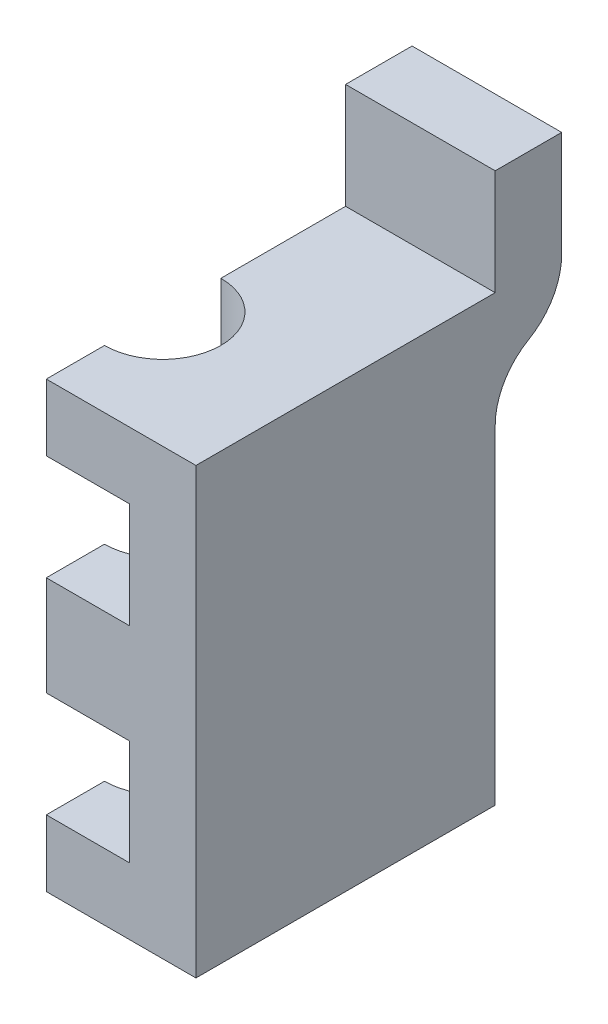
ISO-10303-21;
HEADER;
FILE_DESCRIPTION(('STEP AP214'),'2;1');
FILE_NAME('part.step','',(''),(''),'','','');
FILE_SCHEMA(('AUTOMOTIVE_DESIGN { 1 0 10303 214 1 1 1 1 }'));
ENDSEC;
DATA;
#1=APPLICATION_CONTEXT('core data for automotive mechanical design processes');
#2=APPLICATION_PROTOCOL_DEFINITION('international standard','automotive_design',2000,#1);
#3=PRODUCT_CONTEXT('',#1,'mechanical');
#4=PRODUCT('Part','Part','',(#3));
#5=PRODUCT_RELATED_PRODUCT_CATEGORY('part','',(#4));
#6=PRODUCT_DEFINITION_FORMATION('','',#4);
#7=PRODUCT_DEFINITION_CONTEXT('part definition',#1,'design');
#8=PRODUCT_DEFINITION('design','',#6,#7);
#9=PRODUCT_DEFINITION_SHAPE('','',#8);
#10=(LENGTH_UNIT() NAMED_UNIT(*) SI_UNIT(.MILLI.,.METRE.));
#11=(NAMED_UNIT(*) PLANE_ANGLE_UNIT() SI_UNIT($,.RADIAN.));
#12=(NAMED_UNIT(*) SI_UNIT($,.STERADIAN.) SOLID_ANGLE_UNIT());
#13=UNCERTAINTY_MEASURE_WITH_UNIT(LENGTH_MEASURE(1.E-05),#10,'distance_accuracy_value','');
#14=(GEOMETRIC_REPRESENTATION_CONTEXT(3) GLOBAL_UNCERTAINTY_ASSIGNED_CONTEXT((#13)) GLOBAL_UNIT_ASSIGNED_CONTEXT((#10,
#11,#12)) REPRESENTATION_CONTEXT('',''));
#15=CARTESIAN_POINT('',(0.,0.,0.));
#16=DIRECTION('',(0.,0.,1.));
#17=DIRECTION('',(1.,0.,0.));
#18=AXIS2_PLACEMENT_3D('',#15,#16,#17);
#19=CARTESIAN_POINT('',(0.,-11.35,3.5));
#20=DIRECTION('',(1.,0.,0.));
#21=DIRECTION('',(0.,1.,0.));
#22=AXIS2_PLACEMENT_3D('',#19,#20,#21);
#23=PLANE('',#22);
#24=DIRECTION('',(0.,0.,-1.));
#25=VECTOR('',#24,1.);
#26=CARTESIAN_POINT('',(0.,-13.35,3.5));
#27=LINE('',#26,#25);
#28=CARTESIAN_POINT('',(0.,-13.35,-1.75));
#29=VERTEX_POINT('',#28);
#30=CARTESIAN_POINT('',(0.,-13.35,-5.5));
#31=VERTEX_POINT('',#30);
#32=EDGE_CURVE('E376',#29,#31,#27,.T.);
#33=ORIENTED_EDGE('',*,*,#32,.F.);
#34=DIRECTION('',(0.,1.,0.));
#35=VECTOR('',#34,1.);
#36=CARTESIAN_POINT('',(0.,-13.35,-1.75));
#37=LINE('',#36,#35);
#38=CARTESIAN_POINT('',(0.,-11.35,-1.75));
#39=VERTEX_POINT('',#38);
#40=EDGE_CURVE('E267',#29,#39,#37,.T.);
#41=ORIENTED_EDGE('',*,*,#40,.T.);
#42=DIRECTION('',(0.,0.,-1.));
#43=VECTOR('',#42,1.);
#44=CARTESIAN_POINT('',(0.,-11.35,3.5));
#45=LINE('',#44,#43);
#46=CARTESIAN_POINT('',(0.,-11.35,-3.5));
#47=VERTEX_POINT('',#46);
#48=EDGE_CURVE('E381',#39,#47,#45,.T.);
#49=ORIENTED_EDGE('',*,*,#48,.T.);
#50=DIRECTION('',(0.,1.,0.));
#51=VECTOR('',#50,1.);
#52=CARTESIAN_POINT('',(0.,0.,-3.5));
#53=LINE('',#52,#51);
#54=CARTESIAN_POINT('',(0.,-8.175,-3.5));
#55=VERTEX_POINT('',#54);
#56=EDGE_CURVE('E289',#47,#55,#53,.T.);
#57=ORIENTED_EDGE('',*,*,#56,.T.);
#58=DIRECTION('',(0.,0.,-1.));
#59=VECTOR('',#58,1.);
#60=CARTESIAN_POINT('',(0.,-8.175,3.5));
#61=LINE('',#60,#59);
#62=CARTESIAN_POINT('',(0.,-8.175,-1.75));
#63=VERTEX_POINT('',#62);
#64=EDGE_CURVE('E394',#63,#55,#61,.T.);
#65=ORIENTED_EDGE('',*,*,#64,.F.);
#66=CARTESIAN_POINT('',(0.,-5.175,-1.75));
#67=VERTEX_POINT('',#66);
#68=EDGE_CURVE('E272',#63,#67,#37,.T.);
#69=ORIENTED_EDGE('',*,*,#68,.T.);
#70=DIRECTION('',(0.,0.,-1.));
#71=VECTOR('',#70,1.);
#72=CARTESIAN_POINT('',(0.,-5.175,3.5));
#73=LINE('',#72,#71);
#74=CARTESIAN_POINT('',(0.,-5.175,-3.5));
#75=VERTEX_POINT('',#74);
#76=EDGE_CURVE('E399',#67,#75,#73,.T.);
#77=ORIENTED_EDGE('',*,*,#76,.T.);
#78=CARTESIAN_POINT('',(0.,-2.,-3.5));
#79=VERTEX_POINT('',#78);
#80=EDGE_CURVE('E301',#75,#79,#53,.T.);
#81=ORIENTED_EDGE('',*,*,#80,.T.);
#82=DIRECTION('',(0.,0.,-1.));
#83=VECTOR('',#82,1.);
#84=CARTESIAN_POINT('',(0.,-2.,3.5));
#85=LINE('',#84,#83);
#86=CARTESIAN_POINT('',(0.,-2.,-1.75));
#87=VERTEX_POINT('',#86);
#88=EDGE_CURVE('E412',#87,#79,#85,.T.);
#89=ORIENTED_EDGE('',*,*,#88,.F.);
#90=CARTESIAN_POINT('',(0.,0.,-1.75));
#91=VERTEX_POINT('',#90);
#92=EDGE_CURVE('E271',#87,#91,#37,.T.);
#93=ORIENTED_EDGE('',*,*,#92,.T.);
#94=DIRECTION('',(0.,0.,-1.));
#95=VECTOR('',#94,1.);
#96=CARTESIAN_POINT('',(0.,0.,3.5));
#97=LINE('',#96,#95);
#98=CARTESIAN_POINT('',(0.,0.,-5.5));
#99=VERTEX_POINT('',#98);
#100=EDGE_CURVE('E343',#91,#99,#97,.T.);
#101=ORIENTED_EDGE('',*,*,#100,.T.);
#102=DIRECTION('',(0.,1.,0.));
#103=VECTOR('',#102,1.);
#104=CARTESIAN_POINT('',(0.,3.175,-5.5));
#105=LINE('',#104,#103);
#106=CARTESIAN_POINT('',(0.,3.175,-5.5));
#107=VERTEX_POINT('',#106);
#108=EDGE_CURVE('E231',#99,#107,#105,.T.);
#109=ORIENTED_EDGE('',*,*,#108,.T.);
#110=DIRECTION('',(0.,0.,-1.));
#111=VECTOR('',#110,1.);
#112=CARTESIAN_POINT('',(0.,3.175,-7.5));
#113=LINE('',#112,#111);
#114=CARTESIAN_POINT('',(0.,3.175,-7.5));
#115=VERTEX_POINT('',#114);
#116=EDGE_CURVE('E227',#107,#115,#113,.T.);
#117=ORIENTED_EDGE('',*,*,#116,.T.);
#118=DIRECTION('',(0.,-1.,0.));
#119=VECTOR('',#118,1.);
#120=CARTESIAN_POINT('',(0.,3.175,-7.5));
#121=LINE('',#120,#119);
#122=CARTESIAN_POINT('',(0.,0.,-7.5));
#123=VERTEX_POINT('',#122);
#124=EDGE_CURVE('E238',#115,#123,#121,.T.);
#125=ORIENTED_EDGE('',*,*,#124,.T.);
#126=CARTESIAN_POINT('',(0.,0.,-5.5));
#127=DIRECTION('',(-1.,0.,0.));
#128=DIRECTION('',(0.,-1.,0.));
#129=AXIS2_PLACEMENT_3D('',#126,#127,#128);
#130=CIRCLE('',#129,2.);
#131=CARTESIAN_POINT('',(0.,-1.73205080756888,-6.5));
#132=VERTEX_POINT('',#131);
#133=EDGE_CURVE('E204',#123,#132,#130,.T.);
#134=ORIENTED_EDGE('',*,*,#133,.T.);
#135=CARTESIAN_POINT('',(0.,-3.46410161513775,-7.5));
#136=DIRECTION('',(1.,0.,0.));
#137=DIRECTION('',(0.,1.,0.));
#138=AXIS2_PLACEMENT_3D('',#135,#136,#137);
#139=CIRCLE('',#138,2.);
#140=CARTESIAN_POINT('',(0.,-3.46410161513775,-5.5));
#141=VERTEX_POINT('',#140);
#142=EDGE_CURVE('E52',#132,#141,#139,.T.);
#143=ORIENTED_EDGE('',*,*,#142,.T.);
#144=DIRECTION('',(0.,1.,0.));
#145=VECTOR('',#144,1.);
#146=CARTESIAN_POINT('',(0.,0.,-5.5));
#147=LINE('',#146,#145);
#148=EDGE_CURVE('E293',#31,#141,#147,.T.);
#149=ORIENTED_EDGE('',*,*,#148,.F.);
#150=EDGE_LOOP('',(#33,#41,#49,#57,#65,#69,#77,#81,#89,#93,#101,#109,#117,#125,#134,#143,#149));
#151=FACE_BOUND('',#150,.T.);
#152=ADVANCED_FACE('F43',(#151),#23,.F.);
#153=CARTESIAN_POINT('',(0.,0.,3.5));
#154=VERTEX_POINT('',#153);
#155=CARTESIAN_POINT('',(0.,0.,1.75));
#156=VERTEX_POINT('',#155);
#157=EDGE_CURVE('E366',#154,#156,#97,.T.);
#158=ORIENTED_EDGE('',*,*,#157,.T.);
#159=DIRECTION('',(0.,1.,0.));
#160=VECTOR('',#159,1.);
#161=CARTESIAN_POINT('',(0.,-13.35,1.75));
#162=LINE('',#161,#160);
#163=CARTESIAN_POINT('',(0.,-2.,1.75));
#164=VERTEX_POINT('',#163);
#165=EDGE_CURVE('E262',#156,#164,#162,.F.);
#166=ORIENTED_EDGE('',*,*,#165,.T.);
#167=CARTESIAN_POINT('',(0.,-2.,3.5));
#168=VERTEX_POINT('',#167);
#169=EDGE_CURVE('E413',#168,#164,#85,.T.);
#170=ORIENTED_EDGE('',*,*,#169,.F.);
#171=DIRECTION('',(0.,-1.,0.));
#172=VECTOR('',#171,1.);
#173=CARTESIAN_POINT('',(0.,0.,3.5));
#174=LINE('',#173,#172);
#175=EDGE_CURVE('E305',#154,#168,#174,.T.);
#176=ORIENTED_EDGE('',*,*,#175,.F.);
#177=EDGE_LOOP('',(#158,#166,#170,#176));
#178=FACE_BOUND('',#177,.T.);
#179=ADVANCED_FACE('F494',(#178),#23,.F.);
#180=CARTESIAN_POINT('',(0.,-5.175,3.5));
#181=VERTEX_POINT('',#180);
#182=CARTESIAN_POINT('',(0.,-5.175,1.75));
#183=VERTEX_POINT('',#182);
#184=EDGE_CURVE('E400',#181,#183,#73,.T.);
#185=ORIENTED_EDGE('',*,*,#184,.T.);
#186=CARTESIAN_POINT('',(0.,-8.175,1.75));
#187=VERTEX_POINT('',#186);
#188=EDGE_CURVE('E263',#183,#187,#162,.F.);
#189=ORIENTED_EDGE('',*,*,#188,.T.);
#190=CARTESIAN_POINT('',(0.,-8.175,3.5));
#191=VERTEX_POINT('',#190);
#192=EDGE_CURVE('E395',#191,#187,#61,.T.);
#193=ORIENTED_EDGE('',*,*,#192,.F.);
#194=DIRECTION('',(0.,-1.,0.));
#195=VECTOR('',#194,1.);
#196=CARTESIAN_POINT('',(0.,-5.175,3.5));
#197=LINE('',#196,#195);
#198=EDGE_CURVE('E319',#181,#191,#197,.T.);
#199=ORIENTED_EDGE('',*,*,#198,.F.);
#200=EDGE_LOOP('',(#185,#189,#193,#199));
#201=FACE_BOUND('',#200,.T.);
#202=ADVANCED_FACE('F440',(#201),#23,.F.);
#203=CARTESIAN_POINT('',(0.,-2.,3.5));
#204=DIRECTION('',(0.,1.,0.));
#205=DIRECTION('',(0.,0.,1.));
#206=AXIS2_PLACEMENT_3D('',#203,#204,#205);
#207=PLANE('',#206);
#208=ORIENTED_EDGE('',*,*,#169,.T.);
#209=CARTESIAN_POINT('',(0.,-2.,0.));
#210=DIRECTION('',(0.,1.,0.));
#211=DIRECTION('',(0.,0.,1.));
#212=AXIS2_PLACEMENT_3D('',#209,#210,#211);
#213=CIRCLE('',#212,1.75);
#214=EDGE_CURVE('E281',#164,#87,#213,.T.);
#215=ORIENTED_EDGE('',*,*,#214,.T.);
#216=ORIENTED_EDGE('',*,*,#88,.T.);
#217=DIRECTION('',(1.,0.,0.));
#218=VECTOR('',#217,1.);
#219=CARTESIAN_POINT('',(0.,-2.,-3.5));
#220=LINE('',#219,#218);
#221=CARTESIAN_POINT('',(2.5,-2.,-3.5));
#222=VERTEX_POINT('',#221);
#223=EDGE_CURVE('E300',#79,#222,#220,.T.);
#224=ORIENTED_EDGE('',*,*,#223,.T.);
#225=DIRECTION('',(0.,0.,-1.));
#226=VECTOR('',#225,1.);
#227=CARTESIAN_POINT('',(2.5,-2.,3.5));
#228=LINE('',#227,#226);
#229=CARTESIAN_POINT('',(2.5,-2.,3.5));
#230=VERTEX_POINT('',#229);
#231=EDGE_CURVE('E408',#230,#222,#228,.T.);
#232=ORIENTED_EDGE('',*,*,#231,.F.);
#233=DIRECTION('',(1.,0.,0.));
#234=VECTOR('',#233,1.);
#235=CARTESIAN_POINT('',(0.,-2.,3.5));
#236=LINE('',#235,#234);
#237=EDGE_CURVE('E309',#168,#230,#236,.T.);
#238=ORIENTED_EDGE('',*,*,#237,.F.);
#239=EDGE_LOOP('',(#208,#215,#216,#224,#232,#238));
#240=FACE_BOUND('',#239,.T.);
#241=ADVANCED_FACE('F496',(#240),#207,.F.);
#242=CARTESIAN_POINT('',(2.5,-2.,3.5));
#243=DIRECTION('',(1.,0.,0.));
#244=DIRECTION('',(0.,1.,0.));
#245=AXIS2_PLACEMENT_3D('',#242,#243,#244);
#246=PLANE('',#245);
#247=DIRECTION('',(0.,-1.,0.));
#248=VECTOR('',#247,1.);
#249=CARTESIAN_POINT('',(2.5,-2.,-3.5));
#250=LINE('',#249,#248);
#251=CARTESIAN_POINT('',(2.5,-5.175,-3.5));
#252=VERTEX_POINT('',#251);
#253=EDGE_CURVE('E347',#222,#252,#250,.T.);
#254=ORIENTED_EDGE('',*,*,#253,.T.);
#255=DIRECTION('',(0.,0.,-1.));
#256=VECTOR('',#255,1.);
#257=CARTESIAN_POINT('',(2.5,-5.175,3.5));
#258=LINE('',#257,#256);
#259=CARTESIAN_POINT('',(2.5,-5.175,3.5));
#260=VERTEX_POINT('',#259);
#261=EDGE_CURVE('E404',#260,#252,#258,.T.);
#262=ORIENTED_EDGE('',*,*,#261,.F.);
#263=DIRECTION('',(0.,-1.,0.));
#264=VECTOR('',#263,1.);
#265=CARTESIAN_POINT('',(2.5,-2.,3.5));
#266=LINE('',#265,#264);
#267=EDGE_CURVE('E313',#230,#260,#266,.T.);
#268=ORIENTED_EDGE('',*,*,#267,.F.);
#269=ORIENTED_EDGE('',*,*,#231,.T.);
#270=EDGE_LOOP('',(#254,#262,#268,#269));
#271=FACE_BOUND('',#270,.T.);
#272=ADVANCED_FACE('F501',(#271),#246,.F.);
#273=CARTESIAN_POINT('',(2.5,-5.175,3.5));
#274=DIRECTION('',(0.,-1.,0.));
#275=DIRECTION('',(0.,0.,-1.));
#276=AXIS2_PLACEMENT_3D('',#273,#274,#275);
#277=PLANE('',#276);
#278=ORIENTED_EDGE('',*,*,#76,.F.);
#279=CARTESIAN_POINT('',(0.,-5.175,0.));
#280=DIRECTION('',(0.,-1.,0.));
#281=DIRECTION('',(0.,0.,-1.));
#282=AXIS2_PLACEMENT_3D('',#279,#280,#281);
#283=CIRCLE('',#282,1.75);
#284=EDGE_CURVE('E277',#67,#183,#283,.T.);
#285=ORIENTED_EDGE('',*,*,#284,.T.);
#286=ORIENTED_EDGE('',*,*,#184,.F.);
#287=DIRECTION('',(-1.,0.,0.));
#288=VECTOR('',#287,1.);
#289=CARTESIAN_POINT('',(2.5,-5.175,3.5));
#290=LINE('',#289,#288);
#291=EDGE_CURVE('E316',#260,#181,#290,.T.);
#292=ORIENTED_EDGE('',*,*,#291,.F.);
#293=ORIENTED_EDGE('',*,*,#261,.T.);
#294=DIRECTION('',(-1.,0.,0.));
#295=VECTOR('',#294,1.);
#296=CARTESIAN_POINT('',(2.5,-5.175,-3.5));
#297=LINE('',#296,#295);
#298=EDGE_CURVE('E351',#252,#75,#297,.T.);
#299=ORIENTED_EDGE('',*,*,#298,.T.);
#300=EDGE_LOOP('',(#278,#285,#286,#292,#293,#299));
#301=FACE_BOUND('',#300,.T.);
#302=ADVANCED_FACE('F458',(#301),#277,.F.);
#303=CARTESIAN_POINT('',(0.,-8.175,3.5));
#304=DIRECTION('',(0.,1.,0.));
#305=DIRECTION('',(0.,0.,1.));
#306=AXIS2_PLACEMENT_3D('',#303,#304,#305);
#307=PLANE('',#306);
#308=ORIENTED_EDGE('',*,*,#192,.T.);
#309=CARTESIAN_POINT('',(0.,-8.175,0.));
#310=DIRECTION('',(0.,1.,0.));
#311=DIRECTION('',(0.,0.,1.));
#312=AXIS2_PLACEMENT_3D('',#309,#310,#311);
#313=CIRCLE('',#312,1.75);
#314=EDGE_CURVE('E273',#187,#63,#313,.T.);
#315=ORIENTED_EDGE('',*,*,#314,.T.);
#316=ORIENTED_EDGE('',*,*,#64,.T.);
#317=DIRECTION('',(1.,0.,0.));
#318=VECTOR('',#317,1.);
#319=CARTESIAN_POINT('',(0.,-8.175,-3.5));
#320=LINE('',#319,#318);
#321=CARTESIAN_POINT('',(2.5,-8.175,-3.5));
#322=VERTEX_POINT('',#321);
#323=EDGE_CURVE('E355',#55,#322,#320,.T.);
#324=ORIENTED_EDGE('',*,*,#323,.T.);
#325=DIRECTION('',(0.,0.,-1.));
#326=VECTOR('',#325,1.);
#327=CARTESIAN_POINT('',(2.5,-8.175,3.5));
#328=LINE('',#327,#326);
#329=CARTESIAN_POINT('',(2.5,-8.175,3.5));
#330=VERTEX_POINT('',#329);
#331=EDGE_CURVE('E390',#330,#322,#328,.T.);
#332=ORIENTED_EDGE('',*,*,#331,.F.);
#333=DIRECTION('',(1.,0.,0.));
#334=VECTOR('',#333,1.);
#335=CARTESIAN_POINT('',(0.,-8.175,3.5));
#336=LINE('',#335,#334);
#337=EDGE_CURVE('E322',#191,#330,#336,.T.);
#338=ORIENTED_EDGE('',*,*,#337,.F.);
#339=EDGE_LOOP('',(#308,#315,#316,#324,#332,#338));
#340=FACE_BOUND('',#339,.T.);
#341=ADVANCED_FACE('F446',(#340),#307,.F.);
#342=CARTESIAN_POINT('',(2.5,-8.175,3.5));
#343=DIRECTION('',(1.,0.,0.));
#344=DIRECTION('',(0.,1.,0.));
#345=AXIS2_PLACEMENT_3D('',#342,#343,#344);
#346=PLANE('',#345);
#347=DIRECTION('',(0.,-1.,0.));
#348=VECTOR('',#347,1.);
#349=CARTESIAN_POINT('',(2.5,-8.175,-3.5));
#350=LINE('',#349,#348);
#351=CARTESIAN_POINT('',(2.5,-11.35,-3.5));
#352=VERTEX_POINT('',#351);
#353=EDGE_CURVE('E359',#322,#352,#350,.T.);
#354=ORIENTED_EDGE('',*,*,#353,.T.);
#355=DIRECTION('',(0.,0.,-1.));
#356=VECTOR('',#355,1.);
#357=CARTESIAN_POINT('',(2.5,-11.35,3.5));
#358=LINE('',#357,#356);
#359=CARTESIAN_POINT('',(2.5,-11.35,3.5));
#360=VERTEX_POINT('',#359);
#361=EDGE_CURVE('E386',#360,#352,#358,.T.);
#362=ORIENTED_EDGE('',*,*,#361,.F.);
#363=DIRECTION('',(0.,-1.,0.));
#364=VECTOR('',#363,1.);
#365=CARTESIAN_POINT('',(2.5,-8.175,3.5));
#366=LINE('',#365,#364);
#367=EDGE_CURVE('E325',#330,#360,#366,.T.);
#368=ORIENTED_EDGE('',*,*,#367,.F.);
#369=ORIENTED_EDGE('',*,*,#331,.T.);
#370=EDGE_LOOP('',(#354,#362,#368,#369));
#371=FACE_BOUND('',#370,.T.);
#372=ADVANCED_FACE('F467',(#371),#346,.F.);
#373=CARTESIAN_POINT('',(2.5,-11.35,3.5));
#374=DIRECTION('',(0.,-1.,0.));
#375=DIRECTION('',(0.,0.,-1.));
#376=AXIS2_PLACEMENT_3D('',#373,#374,#375);
#377=PLANE('',#376);
#378=ORIENTED_EDGE('',*,*,#48,.F.);
#379=CARTESIAN_POINT('',(0.,-11.35,0.));
#380=DIRECTION('',(0.,-1.,0.));
#381=DIRECTION('',(0.,0.,-1.));
#382=AXIS2_PLACEMENT_3D('',#379,#380,#381);
#383=CIRCLE('',#382,1.75);
#384=CARTESIAN_POINT('',(0.,-11.35,1.75));
#385=VERTEX_POINT('',#384);
#386=EDGE_CURVE('E261',#39,#385,#383,.T.);
#387=ORIENTED_EDGE('',*,*,#386,.T.);
#388=CARTESIAN_POINT('',(0.,-11.35,3.5));
#389=VERTEX_POINT('',#388);
#390=EDGE_CURVE('E382',#389,#385,#45,.T.);
#391=ORIENTED_EDGE('',*,*,#390,.F.);
#392=DIRECTION('',(-1.,0.,0.));
#393=VECTOR('',#392,1.);
#394=CARTESIAN_POINT('',(2.5,-11.35,3.5));
#395=LINE('',#394,#393);
#396=EDGE_CURVE('E328',#360,#389,#395,.T.);
#397=ORIENTED_EDGE('',*,*,#396,.F.);
#398=ORIENTED_EDGE('',*,*,#361,.T.);
#399=DIRECTION('',(-1.,0.,0.));
#400=VECTOR('',#399,1.);
#401=CARTESIAN_POINT('',(2.5,-11.35,-3.5));
#402=LINE('',#401,#400);
#403=EDGE_CURVE('E310',#352,#47,#402,.T.);
#404=ORIENTED_EDGE('',*,*,#403,.T.);
#405=EDGE_LOOP('',(#378,#387,#391,#397,#398,#404));
#406=FACE_BOUND('',#405,.T.);
#407=ADVANCED_FACE('F471',(#406),#377,.F.);
#408=ORIENTED_EDGE('',*,*,#390,.T.);
#409=CARTESIAN_POINT('',(0.,-13.35,1.75));
#410=VERTEX_POINT('',#409);
#411=EDGE_CURVE('E255',#385,#410,#162,.F.);
#412=ORIENTED_EDGE('',*,*,#411,.T.);
#413=CARTESIAN_POINT('',(0.,-13.35,3.5));
#414=VERTEX_POINT('',#413);
#415=EDGE_CURVE('E377',#414,#410,#27,.T.);
#416=ORIENTED_EDGE('',*,*,#415,.F.);
#417=DIRECTION('',(0.,-1.,0.));
#418=VECTOR('',#417,1.);
#419=CARTESIAN_POINT('',(0.,-11.35,3.5));
#420=LINE('',#419,#418);
#421=EDGE_CURVE('E331',#389,#414,#420,.T.);
#422=ORIENTED_EDGE('',*,*,#421,.F.);
#423=EDGE_LOOP('',(#408,#412,#416,#422));
#424=FACE_BOUND('',#423,.T.);
#425=ADVANCED_FACE('F478',(#424),#23,.F.);
#426=CARTESIAN_POINT('',(0.,-13.35,3.5));
#427=DIRECTION('',(0.,1.,0.));
#428=DIRECTION('',(0.,0.,1.));
#429=AXIS2_PLACEMENT_3D('',#426,#427,#428);
#430=PLANE('',#429);
#431=ORIENTED_EDGE('',*,*,#415,.T.);
#432=CARTESIAN_POINT('',(0.,-13.35,0.));
#433=DIRECTION('',(0.,1.,0.));
#434=DIRECTION('',(0.,0.,1.));
#435=AXIS2_PLACEMENT_3D('',#432,#433,#434);
#436=CIRCLE('',#435,1.75);
#437=EDGE_CURVE('E251',#410,#29,#436,.T.);
#438=ORIENTED_EDGE('',*,*,#437,.T.);
#439=ORIENTED_EDGE('',*,*,#32,.T.);
#440=DIRECTION('',(-1.,0.,0.));
#441=VECTOR('',#440,1.);
#442=CARTESIAN_POINT('',(4.5,-13.35,-5.5));
#443=LINE('',#442,#441);
#444=CARTESIAN_POINT('',(4.5,-13.35,-5.5));
#445=VERTEX_POINT('',#444);
#446=EDGE_CURVE('E288',#445,#31,#443,.T.);
#447=ORIENTED_EDGE('',*,*,#446,.F.);
#448=DIRECTION('',(0.,0.,-1.));
#449=VECTOR('',#448,1.);
#450=CARTESIAN_POINT('',(4.5,-13.35,3.5));
#451=LINE('',#450,#449);
#452=CARTESIAN_POINT('',(4.5,-13.35,3.5));
#453=VERTEX_POINT('',#452);
#454=EDGE_CURVE('E373',#453,#445,#451,.T.);
#455=ORIENTED_EDGE('',*,*,#454,.F.);
#456=DIRECTION('',(1.,0.,0.));
#457=VECTOR('',#456,1.);
#458=CARTESIAN_POINT('',(0.,-13.35,3.5));
#459=LINE('',#458,#457);
#460=EDGE_CURVE('E334',#414,#453,#459,.T.);
#461=ORIENTED_EDGE('',*,*,#460,.F.);
#462=EDGE_LOOP('',(#431,#438,#439,#447,#455,#461));
#463=FACE_BOUND('',#462,.T.);
#464=ADVANCED_FACE('F480',(#463),#430,.F.);
#465=CARTESIAN_POINT('',(4.5,-13.35,3.5));
#466=DIRECTION('',(-1.,0.,0.));
#467=DIRECTION('',(0.,0.,1.));
#468=AXIS2_PLACEMENT_3D('',#465,#466,#467);
#469=PLANE('',#468);
#470=ORIENTED_EDGE('',*,*,#454,.T.);
#471=DIRECTION('',(0.,-1.,0.));
#472=VECTOR('',#471,1.);
#473=CARTESIAN_POINT('',(4.5,0.,-5.5));
#474=LINE('',#473,#472);
#475=CARTESIAN_POINT('',(4.5,-3.46410161513775,-5.5));
#476=VERTEX_POINT('',#475);
#477=EDGE_CURVE('E285',#476,#445,#474,.T.);
#478=ORIENTED_EDGE('',*,*,#477,.F.);
#479=CARTESIAN_POINT('',(4.5,-3.46410161513775,-7.5));
#480=DIRECTION('',(-1.,0.,0.));
#481=DIRECTION('',(0.,0.,1.));
#482=AXIS2_PLACEMENT_3D('',#479,#480,#481);
#483=CIRCLE('',#482,2.);
#484=CARTESIAN_POINT('',(4.5,-1.73205080756888,-6.5));
#485=VERTEX_POINT('',#484);
#486=EDGE_CURVE('E11',#476,#485,#483,.T.);
#487=ORIENTED_EDGE('',*,*,#486,.T.);
#488=CARTESIAN_POINT('',(4.5,0.,-5.5));
#489=DIRECTION('',(-1.,0.,0.));
#490=DIRECTION('',(0.,-1.,0.));
#491=AXIS2_PLACEMENT_3D('',#488,#489,#490);
#492=CIRCLE('',#491,2.);
#493=CARTESIAN_POINT('',(4.5,0.,-7.5));
#494=VERTEX_POINT('',#493);
#495=EDGE_CURVE('E202',#494,#485,#492,.T.);
#496=ORIENTED_EDGE('',*,*,#495,.F.);
#497=DIRECTION('',(0.,-1.,0.));
#498=VECTOR('',#497,1.);
#499=CARTESIAN_POINT('',(4.5,3.175,-7.5));
#500=LINE('',#499,#498);
#501=CARTESIAN_POINT('',(4.5,3.175,-7.5));
#502=VERTEX_POINT('',#501);
#503=EDGE_CURVE('E218',#502,#494,#500,.T.);
#504=ORIENTED_EDGE('',*,*,#503,.F.);
#505=DIRECTION('',(0.,0.,-1.));
#506=VECTOR('',#505,1.);
#507=CARTESIAN_POINT('',(4.5,3.175,-7.5));
#508=LINE('',#507,#506);
#509=CARTESIAN_POINT('',(4.5,3.175,-5.5));
#510=VERTEX_POINT('',#509);
#511=EDGE_CURVE('E211',#510,#502,#508,.T.);
#512=ORIENTED_EDGE('',*,*,#511,.F.);
#513=DIRECTION('',(0.,1.,0.));
#514=VECTOR('',#513,1.);
#515=CARTESIAN_POINT('',(4.5,0.,-5.5));
#516=LINE('',#515,#514);
#517=CARTESIAN_POINT('',(4.5,0.,-5.5));
#518=VERTEX_POINT('',#517);
#519=EDGE_CURVE('E222',#518,#510,#516,.T.);
#520=ORIENTED_EDGE('',*,*,#519,.F.);
#521=DIRECTION('',(0.,0.,-1.));
#522=VECTOR('',#521,1.);
#523=CARTESIAN_POINT('',(4.5,0.,3.5));
#524=LINE('',#523,#522);
#525=CARTESIAN_POINT('',(4.5,0.,3.5));
#526=VERTEX_POINT('',#525);
#527=EDGE_CURVE('E370',#526,#518,#524,.T.);
#528=ORIENTED_EDGE('',*,*,#527,.F.);
#529=DIRECTION('',(0.,1.,0.));
#530=VECTOR('',#529,1.);
#531=CARTESIAN_POINT('',(4.5,-13.35,3.5));
#532=LINE('',#531,#530);
#533=EDGE_CURVE('E337',#453,#526,#532,.T.);
#534=ORIENTED_EDGE('',*,*,#533,.F.);
#535=EDGE_LOOP('',(#470,#478,#487,#496,#504,#512,#520,#528,#534));
#536=FACE_BOUND('',#535,.T.);
#537=ADVANCED_FACE('F216',(#536),#469,.F.);
#538=CARTESIAN_POINT('',(0.,0.,3.5));
#539=DIRECTION('',(0.,-1.,0.));
#540=DIRECTION('',(0.,0.,-1.));
#541=AXIS2_PLACEMENT_3D('',#538,#539,#540);
#542=PLANE('',#541);
#543=ORIENTED_EDGE('',*,*,#100,.F.);
#544=CARTESIAN_POINT('',(0.,0.,0.));
#545=DIRECTION('',(0.,1.,0.));
#546=DIRECTION('',(0.,0.,1.));
#547=AXIS2_PLACEMENT_3D('',#544,#545,#546);
#548=CIRCLE('',#547,1.75);
#549=EDGE_CURVE('E247',#156,#91,#548,.T.);
#550=ORIENTED_EDGE('',*,*,#549,.F.);
#551=ORIENTED_EDGE('',*,*,#157,.F.);
#552=DIRECTION('',(-1.,0.,0.));
#553=VECTOR('',#552,1.);
#554=CARTESIAN_POINT('',(0.,0.,3.5));
#555=LINE('',#554,#553);
#556=EDGE_CURVE('E340',#526,#154,#555,.T.);
#557=ORIENTED_EDGE('',*,*,#556,.F.);
#558=ORIENTED_EDGE('',*,*,#527,.T.);
#559=DIRECTION('',(1.,0.,0.));
#560=VECTOR('',#559,1.);
#561=CARTESIAN_POINT('',(4.5,0.,-5.5));
#562=LINE('',#561,#560);
#563=EDGE_CURVE('E296',#99,#518,#562,.T.);
#564=ORIENTED_EDGE('',*,*,#563,.F.);
#565=EDGE_LOOP('',(#543,#550,#551,#557,#558,#564));
#566=FACE_BOUND('',#565,.T.);
#567=ADVANCED_FACE('F492',(#566),#542,.F.);
#568=CARTESIAN_POINT('',(0.,0.,3.5));
#569=DIRECTION('',(0.,0.,1.));
#570=DIRECTION('',(1.,0.,0.));
#571=AXIS2_PLACEMENT_3D('',#568,#569,#570);
#572=PLANE('',#571);
#573=ORIENTED_EDGE('',*,*,#175,.T.);
#574=ORIENTED_EDGE('',*,*,#237,.T.);
#575=ORIENTED_EDGE('',*,*,#267,.T.);
#576=ORIENTED_EDGE('',*,*,#291,.T.);
#577=ORIENTED_EDGE('',*,*,#198,.T.);
#578=ORIENTED_EDGE('',*,*,#337,.T.);
#579=ORIENTED_EDGE('',*,*,#367,.T.);
#580=ORIENTED_EDGE('',*,*,#396,.T.);
#581=ORIENTED_EDGE('',*,*,#421,.T.);
#582=ORIENTED_EDGE('',*,*,#460,.T.);
#583=ORIENTED_EDGE('',*,*,#533,.T.);
#584=ORIENTED_EDGE('',*,*,#556,.T.);
#585=EDGE_LOOP('',(#573,#574,#575,#576,#577,#578,#579,#580,#581,#582,#583,#584));
#586=FACE_BOUND('',#585,.T.);
#587=ADVANCED_FACE('F451',(#586),#572,.T.);
#588=CARTESIAN_POINT('',(0.,0.,-3.5));
#589=DIRECTION('',(0.,0.,-1.));
#590=DIRECTION('',(-1.,0.,0.));
#591=AXIS2_PLACEMENT_3D('',#588,#589,#590);
#592=PLANE('',#591);
#593=ORIENTED_EDGE('',*,*,#403,.F.);
#594=ORIENTED_EDGE('',*,*,#353,.F.);
#595=ORIENTED_EDGE('',*,*,#323,.F.);
#596=ORIENTED_EDGE('',*,*,#56,.F.);
#597=EDGE_LOOP('',(#593,#594,#595,#596));
#598=FACE_BOUND('',#597,.T.);
#599=ADVANCED_FACE('F465',(#598),#592,.F.);
#600=CARTESIAN_POINT('',(0.,0.,-5.5));
#601=DIRECTION('',(0.,0.,-1.));
#602=DIRECTION('',(-1.,0.,0.));
#603=AXIS2_PLACEMENT_3D('',#600,#601,#602);
#604=PLANE('',#603);
#605=ORIENTED_EDGE('',*,*,#148,.T.);
#606=DIRECTION('',(1.,0.,0.));
#607=VECTOR('',#606,1.);
#608=CARTESIAN_POINT('',(4.5,-3.46410161513775,-5.5));
#609=LINE('',#608,#607);
#610=EDGE_CURVE('E65',#141,#476,#609,.T.);
#611=ORIENTED_EDGE('',*,*,#610,.T.);
#612=ORIENTED_EDGE('',*,*,#477,.T.);
#613=ORIENTED_EDGE('',*,*,#446,.T.);
#614=EDGE_LOOP('',(#605,#611,#612,#613));
#615=FACE_BOUND('',#614,.T.);
#616=ADVANCED_FACE('F655',(#615),#604,.T.);
#617=ORIENTED_EDGE('',*,*,#298,.F.);
#618=ORIENTED_EDGE('',*,*,#253,.F.);
#619=ORIENTED_EDGE('',*,*,#223,.F.);
#620=ORIENTED_EDGE('',*,*,#80,.F.);
#621=EDGE_LOOP('',(#617,#618,#619,#620));
#622=FACE_BOUND('',#621,.T.);
#623=ADVANCED_FACE('F503',(#622),#592,.F.);
#624=CARTESIAN_POINT('',(0.,-13.35,0.));
#625=DIRECTION('',(0.,1.,0.));
#626=DIRECTION('',(0.,0.,1.));
#627=AXIS2_PLACEMENT_3D('',#624,#625,#626);
#628=CYLINDRICAL_SURFACE('',#627,1.75);
#629=ORIENTED_EDGE('',*,*,#214,.F.);
#630=ORIENTED_EDGE('',*,*,#165,.F.);
#631=ORIENTED_EDGE('',*,*,#549,.T.);
#632=ORIENTED_EDGE('',*,*,#92,.F.);
#633=EDGE_LOOP('',(#629,#630,#631,#632));
#634=FACE_BOUND('',#633,.T.);
#635=ADVANCED_FACE('F581',(#634),#628,.F.);
#636=ORIENTED_EDGE('',*,*,#437,.F.);
#637=ORIENTED_EDGE('',*,*,#411,.F.);
#638=ORIENTED_EDGE('',*,*,#386,.F.);
#639=ORIENTED_EDGE('',*,*,#40,.F.);
#640=EDGE_LOOP('',(#636,#637,#638,#639));
#641=FACE_BOUND('',#640,.T.);
#642=ADVANCED_FACE('F586',(#641),#628,.F.);
#643=ORIENTED_EDGE('',*,*,#314,.F.);
#644=ORIENTED_EDGE('',*,*,#188,.F.);
#645=ORIENTED_EDGE('',*,*,#284,.F.);
#646=ORIENTED_EDGE('',*,*,#68,.F.);
#647=EDGE_LOOP('',(#643,#644,#645,#646));
#648=FACE_BOUND('',#647,.T.);
#649=ADVANCED_FACE('F459',(#648),#628,.F.);
#650=CARTESIAN_POINT('',(4.5,3.175,-7.5));
#651=DIRECTION('',(0.,0.,-1.));
#652=DIRECTION('',(-1.,0.,0.));
#653=AXIS2_PLACEMENT_3D('',#650,#651,#652);
#654=PLANE('',#653);
#655=ORIENTED_EDGE('',*,*,#124,.F.);
#656=DIRECTION('',(-1.,0.,0.));
#657=VECTOR('',#656,1.);
#658=CARTESIAN_POINT('',(4.5,3.175,-7.5));
#659=LINE('',#658,#657);
#660=EDGE_CURVE('E225',#502,#115,#659,.T.);
#661=ORIENTED_EDGE('',*,*,#660,.F.);
#662=ORIENTED_EDGE('',*,*,#503,.T.);
#663=DIRECTION('',(-1.,0.,0.));
#664=VECTOR('',#663,1.);
#665=CARTESIAN_POINT('',(4.5,0.,-7.5));
#666=LINE('',#665,#664);
#667=EDGE_CURVE('E198',#494,#123,#666,.T.);
#668=ORIENTED_EDGE('',*,*,#667,.T.);
#669=EDGE_LOOP('',(#655,#661,#662,#668));
#670=FACE_BOUND('',#669,.T.);
#671=ADVANCED_FACE('F224',(#670),#654,.T.);
#672=CARTESIAN_POINT('',(4.5,3.175,-7.5));
#673=DIRECTION('',(0.,1.,0.));
#674=DIRECTION('',(-1.,0.,0.));
#675=AXIS2_PLACEMENT_3D('',#672,#673,#674);
#676=PLANE('',#675);
#677=ORIENTED_EDGE('',*,*,#116,.F.);
#678=DIRECTION('',(-1.,0.,0.));
#679=VECTOR('',#678,1.);
#680=CARTESIAN_POINT('',(4.5,3.175,-5.5));
#681=LINE('',#680,#679);
#682=EDGE_CURVE('E210',#510,#107,#681,.T.);
#683=ORIENTED_EDGE('',*,*,#682,.F.);
#684=ORIENTED_EDGE('',*,*,#511,.T.);
#685=ORIENTED_EDGE('',*,*,#660,.T.);
#686=EDGE_LOOP('',(#677,#683,#684,#685));
#687=FACE_BOUND('',#686,.T.);
#688=ADVANCED_FACE('F512',(#687),#676,.T.);
#689=CARTESIAN_POINT('',(4.5,3.175,-5.5));
#690=DIRECTION('',(0.,0.,1.));
#691=DIRECTION('',(1.,0.,0.));
#692=AXIS2_PLACEMENT_3D('',#689,#690,#691);
#693=PLANE('',#692);
#694=ORIENTED_EDGE('',*,*,#108,.F.);
#695=ORIENTED_EDGE('',*,*,#563,.T.);
#696=ORIENTED_EDGE('',*,*,#519,.T.);
#697=ORIENTED_EDGE('',*,*,#682,.T.);
#698=EDGE_LOOP('',(#694,#695,#696,#697));
#699=FACE_BOUND('',#698,.T.);
#700=ADVANCED_FACE('F508',(#699),#693,.T.);
#701=CARTESIAN_POINT('',(4.5,0.,-5.5));
#702=DIRECTION('',(-1.,0.,0.));
#703=DIRECTION('',(0.,-1.,0.));
#704=AXIS2_PLACEMENT_3D('',#701,#702,#703);
#705=CYLINDRICAL_SURFACE('',#704,2.);
#706=ORIENTED_EDGE('',*,*,#495,.T.);
#707=DIRECTION('',(-1.,0.,0.));
#708=VECTOR('',#707,1.);
#709=CARTESIAN_POINT('',(4.5,-1.73205080756888,-6.5));
#710=LINE('',#709,#708);
#711=EDGE_CURVE('E417',#485,#132,#710,.T.);
#712=ORIENTED_EDGE('',*,*,#711,.T.);
#713=ORIENTED_EDGE('',*,*,#133,.F.);
#714=ORIENTED_EDGE('',*,*,#667,.F.);
#715=EDGE_LOOP('',(#706,#712,#713,#714));
#716=FACE_BOUND('',#715,.T.);
#717=ADVANCED_FACE('F200',(#716),#705,.T.);
#718=CARTESIAN_POINT('',(4.5,-3.46410161513775,-7.5));
#719=DIRECTION('',(-1.,0.,0.));
#720=DIRECTION('',(0.,-1.,0.));
#721=AXIS2_PLACEMENT_3D('',#718,#719,#720);
#722=CYLINDRICAL_SURFACE('',#721,2.);
#723=ORIENTED_EDGE('',*,*,#486,.F.);
#724=ORIENTED_EDGE('',*,*,#610,.F.);
#725=ORIENTED_EDGE('',*,*,#142,.F.);
#726=ORIENTED_EDGE('',*,*,#711,.F.);
#727=EDGE_LOOP('',(#723,#724,#725,#726));
#728=FACE_BOUND('',#727,.T.);
#729=ADVANCED_FACE('F45',(#728),#722,.F.);
#730=CLOSED_SHELL('',(#152,#179,#202,#241,#272,#302,#341,#372,#407,#425,#464,#537,#567,#587,
#599,#616,#623,#635,#642,#649,#671,#688,#700,#717,#729));
#731=MANIFOLD_SOLID_BREP('B2',#730);
#732=ADVANCED_BREP_SHAPE_REPRESENTATION('',(#18,#731),#14);
#733=SHAPE_DEFINITION_REPRESENTATION(#9,#732);
ENDSEC;
END-ISO-10303-21;
